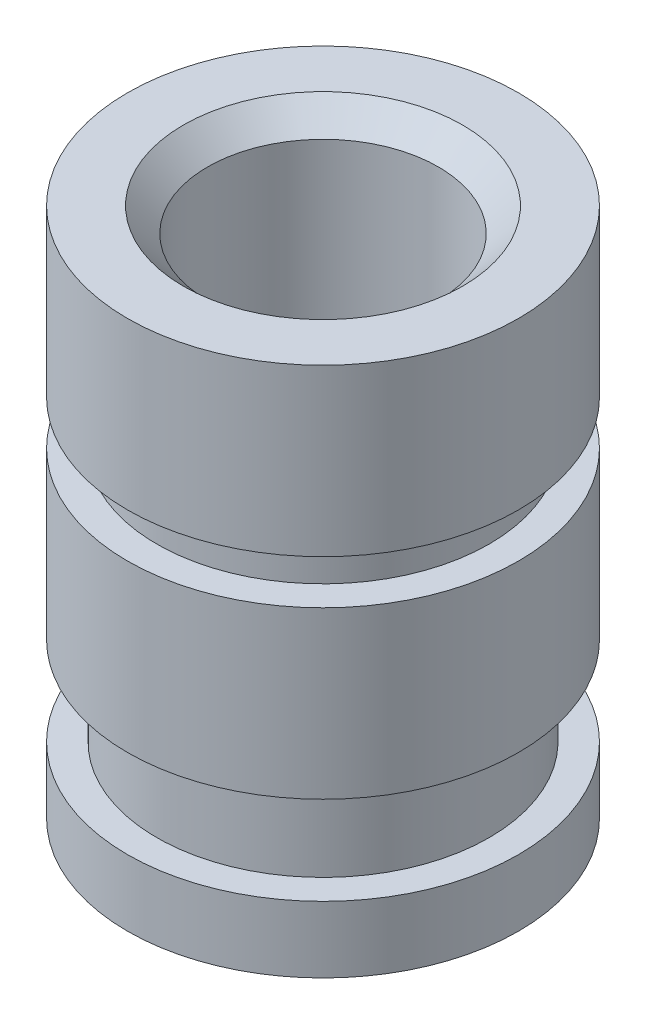
ISO-10303-21;
HEADER;
FILE_DESCRIPTION(('STEP AP214'),'2;1');
FILE_NAME('part.step','',(''),(''),'','','');
FILE_SCHEMA(('AUTOMOTIVE_DESIGN { 1 0 10303 214 1 1 1 1 }'));
ENDSEC;
DATA;
#1=APPLICATION_CONTEXT('core data for automotive mechanical design processes');
#2=APPLICATION_PROTOCOL_DEFINITION('international standard','automotive_design',2000,#1);
#3=PRODUCT_CONTEXT('',#1,'mechanical');
#4=PRODUCT('Part','Part','',(#3));
#5=PRODUCT_RELATED_PRODUCT_CATEGORY('part','',(#4));
#6=PRODUCT_DEFINITION_FORMATION('','',#4);
#7=PRODUCT_DEFINITION_CONTEXT('part definition',#1,'design');
#8=PRODUCT_DEFINITION('design','',#6,#7);
#9=PRODUCT_DEFINITION_SHAPE('','',#8);
#10=(LENGTH_UNIT() NAMED_UNIT(*) SI_UNIT(.MILLI.,.METRE.));
#11=(NAMED_UNIT(*) PLANE_ANGLE_UNIT() SI_UNIT($,.RADIAN.));
#12=(NAMED_UNIT(*) SI_UNIT($,.STERADIAN.) SOLID_ANGLE_UNIT());
#13=UNCERTAINTY_MEASURE_WITH_UNIT(LENGTH_MEASURE(1.E-05),#10,'distance_accuracy_value','');
#14=(GEOMETRIC_REPRESENTATION_CONTEXT(3) GLOBAL_UNCERTAINTY_ASSIGNED_CONTEXT((#13)) GLOBAL_UNIT_ASSIGNED_CONTEXT((#10,
#11,#12)) REPRESENTATION_CONTEXT('',''));
#15=CARTESIAN_POINT('',(0.,0.,0.));
#16=DIRECTION('',(0.,0.,1.));
#17=DIRECTION('',(1.,0.,0.));
#18=AXIS2_PLACEMENT_3D('',#15,#16,#17);
#19=CARTESIAN_POINT('',(0.,0.,0.));
#20=DIRECTION('',(0.,-1.,0.));
#21=DIRECTION('',(1.,0.,0.));
#22=AXIS2_PLACEMENT_3D('',#19,#20,#21);
#23=PLANE('',#22);
#24=CARTESIAN_POINT('',(0.,0.,0.));
#25=DIRECTION('',(0.,-1.,0.));
#26=DIRECTION('',(1.,0.,0.));
#27=AXIS2_PLACEMENT_3D('',#24,#25,#26);
#28=CIRCLE('',#27,2.5);
#29=CARTESIAN_POINT('',(2.5,0.,0.));
#30=VERTEX_POINT('',#29);
#31=EDGE_CURVE('E73',#30,#30,#28,.T.);
#32=ORIENTED_EDGE('',*,*,#31,.F.);
#33=EDGE_LOOP('',(#32));
#34=FACE_BOUND('',#33,.T.);
#35=CARTESIAN_POINT('',(0.,0.,0.));
#36=DIRECTION('',(0.,-1.,0.));
#37=DIRECTION('',(1.,0.,0.));
#38=AXIS2_PLACEMENT_3D('',#35,#36,#37);
#39=CIRCLE('',#38,3.5);
#40=CARTESIAN_POINT('',(3.5,0.,0.));
#41=VERTEX_POINT('',#40);
#42=EDGE_CURVE('E10',#41,#41,#39,.T.);
#43=ORIENTED_EDGE('',*,*,#42,.T.);
#44=EDGE_LOOP('',(#43));
#45=FACE_BOUND('',#44,.T.);
#46=ADVANCED_FACE('F31',(#34,#45),#23,.T.);
#47=CARTESIAN_POINT('',(5.40056451801864E-13,-157.439431358274,0.));
#48=DIRECTION('',(0.,-1.,0.));
#49=DIRECTION('',(1.,0.,0.));
#50=AXIS2_PLACEMENT_3D('',#47,#48,#49);
#51=CYLINDRICAL_SURFACE('',#50,3.5);
#52=CARTESIAN_POINT('',(0.,1.18799999999999,0.));
#53=DIRECTION('',(0.,-1.,0.));
#54=DIRECTION('',(1.,0.,0.));
#55=AXIS2_PLACEMENT_3D('',#52,#53,#54);
#56=CIRCLE('',#55,3.5);
#57=CARTESIAN_POINT('',(3.5,1.18800000000001,0.));
#58=VERTEX_POINT('',#57);
#59=EDGE_CURVE('E37',#58,#58,#56,.T.);
#60=ORIENTED_EDGE('',*,*,#59,.T.);
#61=EDGE_LOOP('',(#60));
#62=FACE_BOUND('',#61,.T.);
#63=ORIENTED_EDGE('',*,*,#42,.F.);
#64=EDGE_LOOP('',(#63));
#65=FACE_BOUND('',#64,.T.);
#66=ADVANCED_FACE('F99',(#62,#65),#51,.T.);
#67=CARTESIAN_POINT('',(3.5,1.188,0.));
#68=DIRECTION('',(0.,1.,0.));
#69=DIRECTION('',(-1.,0.,0.));
#70=AXIS2_PLACEMENT_3D('',#67,#68,#69);
#71=PLANE('',#70);
#72=CARTESIAN_POINT('',(0.,1.18799999999999,0.));
#73=DIRECTION('',(0.,-1.,0.));
#74=DIRECTION('',(1.,0.,0.));
#75=AXIS2_PLACEMENT_3D('',#72,#73,#74);
#76=CIRCLE('',#75,2.975);
#77=CARTESIAN_POINT('',(2.975,1.188,0.));
#78=VERTEX_POINT('',#77);
#79=EDGE_CURVE('E41',#78,#78,#76,.T.);
#80=ORIENTED_EDGE('',*,*,#79,.T.);
#81=EDGE_LOOP('',(#80));
#82=FACE_BOUND('',#81,.T.);
#83=ORIENTED_EDGE('',*,*,#59,.F.);
#84=EDGE_LOOP('',(#83));
#85=FACE_BOUND('',#84,.T.);
#86=ADVANCED_FACE('F104',(#82,#85),#71,.T.);
#87=CARTESIAN_POINT('',(5.40056451801864E-13,-157.439431358274,0.));
#88=DIRECTION('',(0.,-1.,0.));
#89=DIRECTION('',(1.,0.,0.));
#90=AXIS2_PLACEMENT_3D('',#87,#88,#89);
#91=CYLINDRICAL_SURFACE('',#90,2.97500000000001);
#92=CARTESIAN_POINT('',(0.,2.771,0.));
#93=DIRECTION('',(0.,-1.,0.));
#94=DIRECTION('',(1.,0.,0.));
#95=AXIS2_PLACEMENT_3D('',#92,#93,#94);
#96=CIRCLE('',#95,2.97500000000001);
#97=CARTESIAN_POINT('',(2.975,2.77100000000001,0.));
#98=VERTEX_POINT('',#97);
#99=EDGE_CURVE('E45',#98,#98,#96,.T.);
#100=ORIENTED_EDGE('',*,*,#99,.T.);
#101=EDGE_LOOP('',(#100));
#102=FACE_BOUND('',#101,.T.);
#103=ORIENTED_EDGE('',*,*,#79,.F.);
#104=EDGE_LOOP('',(#103));
#105=FACE_BOUND('',#104,.T.);
#106=ADVANCED_FACE('F113',(#102,#105),#91,.T.);
#107=CARTESIAN_POINT('',(2.975,2.771,0.));
#108=DIRECTION('',(0.,-1.,0.));
#109=DIRECTION('',(1.,0.,0.));
#110=AXIS2_PLACEMENT_3D('',#107,#108,#109);
#111=PLANE('',#110);
#112=CARTESIAN_POINT('',(0.,2.771,0.));
#113=DIRECTION('',(0.,-1.,0.));
#114=DIRECTION('',(1.,0.,0.));
#115=AXIS2_PLACEMENT_3D('',#112,#113,#114);
#116=CIRCLE('',#115,3.50000000000001);
#117=CARTESIAN_POINT('',(3.5,2.77100000000001,0.));
#118=VERTEX_POINT('',#117);
#119=EDGE_CURVE('E50',#118,#118,#116,.T.);
#120=ORIENTED_EDGE('',*,*,#119,.T.);
#121=EDGE_LOOP('',(#120));
#122=FACE_BOUND('',#121,.T.);
#123=ORIENTED_EDGE('',*,*,#99,.F.);
#124=EDGE_LOOP('',(#123));
#125=FACE_BOUND('',#124,.T.);
#126=ADVANCED_FACE('F120',(#122,#125),#111,.T.);
#127=CARTESIAN_POINT('',(5.40056451801864E-13,-157.439431358274,0.));
#128=DIRECTION('',(0.,-1.,0.));
#129=DIRECTION('',(1.,0.,0.));
#130=AXIS2_PLACEMENT_3D('',#127,#128,#129);
#131=CYLINDRICAL_SURFACE('',#130,3.50000000000001);
#132=CARTESIAN_POINT('',(0.,5.73999999999999,0.));
#133=DIRECTION('',(0.,-1.,0.));
#134=DIRECTION('',(1.,0.,0.));
#135=AXIS2_PLACEMENT_3D('',#132,#133,#134);
#136=CIRCLE('',#135,3.50000000000002);
#137=CARTESIAN_POINT('',(3.5,5.74000000000001,0.));
#138=VERTEX_POINT('',#137);
#139=EDGE_CURVE('E53',#138,#138,#136,.T.);
#140=ORIENTED_EDGE('',*,*,#139,.T.);
#141=EDGE_LOOP('',(#140));
#142=FACE_BOUND('',#141,.T.);
#143=ORIENTED_EDGE('',*,*,#119,.F.);
#144=EDGE_LOOP('',(#143));
#145=FACE_BOUND('',#144,.T.);
#146=ADVANCED_FACE('F124',(#142,#145),#131,.T.);
#147=CARTESIAN_POINT('',(3.5,5.74,0.));
#148=DIRECTION('',(0.,1.,0.));
#149=DIRECTION('',(-1.,0.,0.));
#150=AXIS2_PLACEMENT_3D('',#147,#148,#149);
#151=PLANE('',#150);
#152=CARTESIAN_POINT('',(0.,5.73999999999999,0.));
#153=DIRECTION('',(0.,-1.,0.));
#154=DIRECTION('',(1.,0.,0.));
#155=AXIS2_PLACEMENT_3D('',#152,#153,#154);
#156=CIRCLE('',#155,2.97500000000002);
#157=CARTESIAN_POINT('',(2.975,5.74000000000001,0.));
#158=VERTEX_POINT('',#157);
#159=EDGE_CURVE('E56',#158,#158,#156,.T.);
#160=ORIENTED_EDGE('',*,*,#159,.T.);
#161=EDGE_LOOP('',(#160));
#162=FACE_BOUND('',#161,.T.);
#163=ORIENTED_EDGE('',*,*,#139,.F.);
#164=EDGE_LOOP('',(#163));
#165=FACE_BOUND('',#164,.T.);
#166=ADVANCED_FACE('F128',(#162,#165),#151,.T.);
#167=CARTESIAN_POINT('',(5.40056451801864E-13,-157.439431358274,0.));
#168=DIRECTION('',(0.,-1.,0.));
#169=DIRECTION('',(1.,0.,0.));
#170=AXIS2_PLACEMENT_3D('',#167,#168,#169);
#171=CYLINDRICAL_SURFACE('',#170,2.97500000000002);
#172=CARTESIAN_POINT('',(0.,6.53200000000001,0.));
#173=DIRECTION('',(0.,-1.,0.));
#174=DIRECTION('',(1.,0.,0.));
#175=AXIS2_PLACEMENT_3D('',#172,#173,#174);
#176=CIRCLE('',#175,2.97500000000002);
#177=CARTESIAN_POINT('',(2.975,6.53200000000002,0.));
#178=VERTEX_POINT('',#177);
#179=EDGE_CURVE('E59',#178,#178,#176,.T.);
#180=ORIENTED_EDGE('',*,*,#179,.T.);
#181=EDGE_LOOP('',(#180));
#182=FACE_BOUND('',#181,.T.);
#183=ORIENTED_EDGE('',*,*,#159,.F.);
#184=EDGE_LOOP('',(#183));
#185=FACE_BOUND('',#184,.T.);
#186=ADVANCED_FACE('F132',(#182,#185),#171,.T.);
#187=CARTESIAN_POINT('',(2.975,6.532,0.));
#188=DIRECTION('',(0.,-1.,0.));
#189=DIRECTION('',(1.,0.,0.));
#190=AXIS2_PLACEMENT_3D('',#187,#188,#189);
#191=PLANE('',#190);
#192=CARTESIAN_POINT('',(0.,6.53200000000001,0.));
#193=DIRECTION('',(0.,-1.,0.));
#194=DIRECTION('',(1.,0.,0.));
#195=AXIS2_PLACEMENT_3D('',#192,#193,#194);
#196=CIRCLE('',#195,3.50000000000002);
#197=CARTESIAN_POINT('',(3.5,6.53200000000002,0.));
#198=VERTEX_POINT('',#197);
#199=EDGE_CURVE('E62',#198,#198,#196,.T.);
#200=ORIENTED_EDGE('',*,*,#199,.T.);
#201=EDGE_LOOP('',(#200));
#202=FACE_BOUND('',#201,.T.);
#203=ORIENTED_EDGE('',*,*,#179,.F.);
#204=EDGE_LOOP('',(#203));
#205=FACE_BOUND('',#204,.T.);
#206=ADVANCED_FACE('F136',(#202,#205),#191,.T.);
#207=CARTESIAN_POINT('',(5.40056451801864E-13,-157.439431358274,0.));
#208=DIRECTION('',(0.,-1.,0.));
#209=DIRECTION('',(1.,0.,0.));
#210=AXIS2_PLACEMENT_3D('',#207,#208,#209);
#211=CYLINDRICAL_SURFACE('',#210,3.50000000000003);
#212=CARTESIAN_POINT('',(0.,9.50100000000001,0.));
#213=DIRECTION('',(0.,-1.,0.));
#214=DIRECTION('',(1.,0.,0.));
#215=AXIS2_PLACEMENT_3D('',#212,#213,#214);
#216=CIRCLE('',#215,3.50000000000003);
#217=CARTESIAN_POINT('',(3.5,9.50100000000002,0.));
#218=VERTEX_POINT('',#217);
#219=EDGE_CURVE('E65',#218,#218,#216,.T.);
#220=ORIENTED_EDGE('',*,*,#219,.T.);
#221=EDGE_LOOP('',(#220));
#222=FACE_BOUND('',#221,.T.);
#223=ORIENTED_EDGE('',*,*,#199,.F.);
#224=EDGE_LOOP('',(#223));
#225=FACE_BOUND('',#224,.T.);
#226=ADVANCED_FACE('F140',(#222,#225),#211,.T.);
#227=CARTESIAN_POINT('',(3.5,9.50100000000001,0.));
#228=DIRECTION('',(0.,1.,0.));
#229=DIRECTION('',(-1.,0.,0.));
#230=AXIS2_PLACEMENT_3D('',#227,#228,#229);
#231=PLANE('',#230);
#232=CARTESIAN_POINT('',(0.,9.50099999999998,0.));
#233=DIRECTION('',(0.,-1.,0.));
#234=DIRECTION('',(1.,0.,0.));
#235=AXIS2_PLACEMENT_3D('',#232,#233,#234);
#236=CIRCLE('',#235,2.49999999999997);
#237=CARTESIAN_POINT('',(2.49999999999994,9.50099999999999,0.));
#238=VERTEX_POINT('',#237);
#239=EDGE_CURVE('E72',#238,#238,#236,.T.);
#240=ORIENTED_EDGE('',*,*,#239,.T.);
#241=EDGE_LOOP('',(#240));
#242=FACE_BOUND('',#241,.T.);
#243=ORIENTED_EDGE('',*,*,#219,.F.);
#244=EDGE_LOOP('',(#243));
#245=FACE_BOUND('',#244,.T.);
#246=ADVANCED_FACE('F81',(#242,#245),#231,.T.);
#247=CARTESIAN_POINT('',(0.,0.433000000000128,0.));
#248=DIRECTION('',(0.,-1.,0.));
#249=DIRECTION('',(1.,0.,0.));
#250=AXIS2_PLACEMENT_3D('',#247,#248,#249);
#251=CONICAL_SURFACE('',#250,2.067,0.785398163397302);
#252=ORIENTED_EDGE('',*,*,#31,.T.);
#253=EDGE_LOOP('',(#252));
#254=FACE_BOUND('',#253,.T.);
#255=CARTESIAN_POINT('',(0.,0.433000000000128,0.));
#256=DIRECTION('',(0.,-1.,0.));
#257=DIRECTION('',(1.,0.,0.));
#258=AXIS2_PLACEMENT_3D('',#255,#256,#257);
#259=CIRCLE('',#258,2.067);
#260=CARTESIAN_POINT('',(2.067,0.433000000000135,0.));
#261=VERTEX_POINT('',#260);
#262=EDGE_CURVE('E69',#261,#261,#259,.T.);
#263=ORIENTED_EDGE('',*,*,#262,.F.);
#264=EDGE_LOOP('',(#263));
#265=FACE_BOUND('',#264,.T.);
#266=ADVANCED_FACE('F87',(#254,#265),#251,.F.);
#267=CARTESIAN_POINT('',(0.,9.50099999999998,0.));
#268=DIRECTION('',(0.,1.,0.));
#269=DIRECTION('',(-1.,0.,0.));
#270=AXIS2_PLACEMENT_3D('',#267,#268,#269);
#271=CONICAL_SURFACE('',#270,2.49999999999997,0.785398163397299);
#272=CARTESIAN_POINT('',(0.,9.06799999999985,0.));
#273=DIRECTION('',(0.,-1.,0.));
#274=DIRECTION('',(1.,0.,0.));
#275=AXIS2_PLACEMENT_3D('',#272,#273,#274);
#276=CIRCLE('',#275,2.06699999999997);
#277=CARTESIAN_POINT('',(2.06699999999994,9.06799999999986,0.));
#278=VERTEX_POINT('',#277);
#279=EDGE_CURVE('E68',#278,#278,#276,.T.);
#280=ORIENTED_EDGE('',*,*,#279,.T.);
#281=EDGE_LOOP('',(#280));
#282=FACE_BOUND('',#281,.T.);
#283=ORIENTED_EDGE('',*,*,#239,.F.);
#284=EDGE_LOOP('',(#283));
#285=FACE_BOUND('',#284,.T.);
#286=ADVANCED_FACE('F84',(#282,#285),#271,.F.);
#287=CARTESIAN_POINT('',(0.,-0.001000000000001,0.));
#288=DIRECTION('',(0.,1.,0.));
#289=DIRECTION('',(-1.,0.,0.));
#290=AXIS2_PLACEMENT_3D('',#287,#288,#289);
#291=CYLINDRICAL_SURFACE('',#290,2.067);
#292=ORIENTED_EDGE('',*,*,#262,.T.);
#293=EDGE_LOOP('',(#292));
#294=FACE_BOUND('',#293,.T.);
#295=ORIENTED_EDGE('',*,*,#279,.F.);
#296=EDGE_LOOP('',(#295));
#297=FACE_BOUND('',#296,.T.);
#298=ADVANCED_FACE('F86',(#294,#297),#291,.F.);
#299=CLOSED_SHELL('',(#46,#66,#86,#106,#126,#146,#166,#186,#206,#226,#246,#266,#286,#298));
#300=MANIFOLD_SOLID_BREP('B2',#299);
#301=ADVANCED_BREP_SHAPE_REPRESENTATION('',(#18,#300),#14);
#302=SHAPE_DEFINITION_REPRESENTATION(#9,#301);
ENDSEC;
END-ISO-10303-21;
